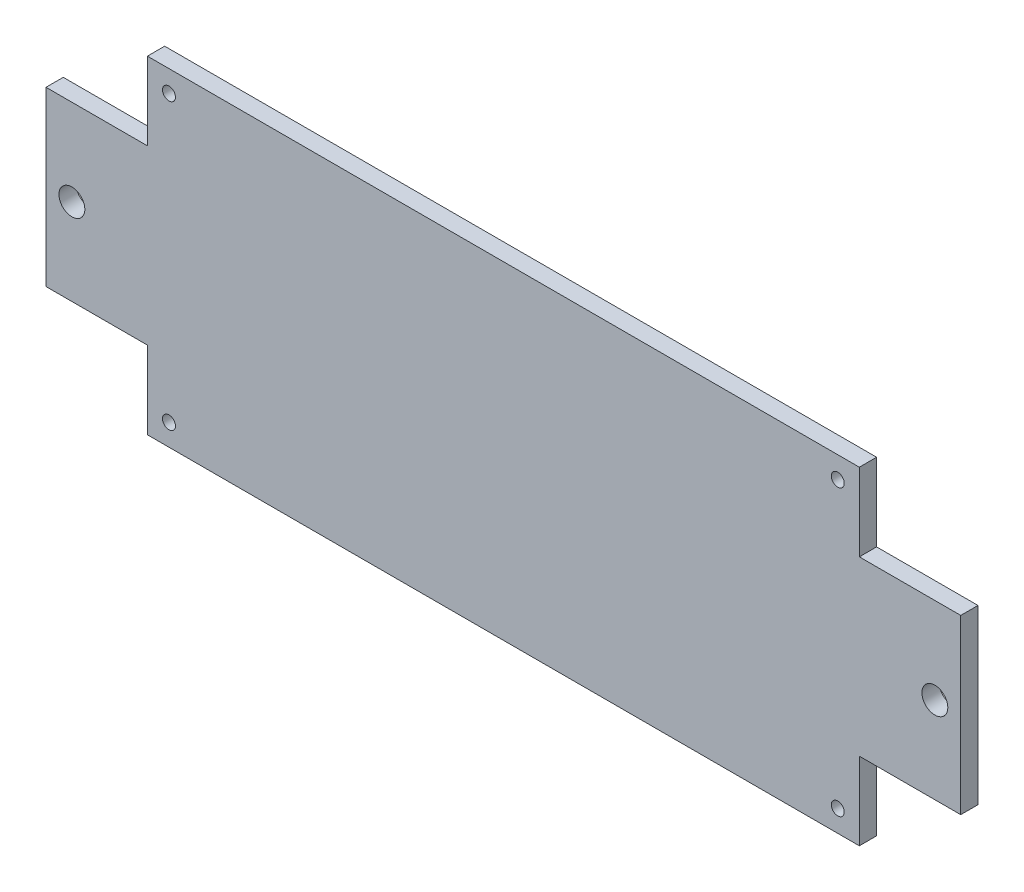
ISO-10303-21;
HEADER;
FILE_DESCRIPTION(('STEP AP214'),'2;1');
FILE_NAME('part.step','',(''),(''),'','','');
FILE_SCHEMA(('AUTOMOTIVE_DESIGN { 1 0 10303 214 1 1 1 1 }'));
ENDSEC;
DATA;
#1=APPLICATION_CONTEXT('core data for automotive mechanical design processes');
#2=APPLICATION_PROTOCOL_DEFINITION('international standard','automotive_design',2000,#1);
#3=PRODUCT_CONTEXT('',#1,'mechanical');
#4=PRODUCT('Part','Part','',(#3));
#5=PRODUCT_RELATED_PRODUCT_CATEGORY('part','',(#4));
#6=PRODUCT_DEFINITION_FORMATION('','',#4);
#7=PRODUCT_DEFINITION_CONTEXT('part definition',#1,'design');
#8=PRODUCT_DEFINITION('design','',#6,#7);
#9=PRODUCT_DEFINITION_SHAPE('','',#8);
#10=(LENGTH_UNIT() NAMED_UNIT(*) SI_UNIT(.MILLI.,.METRE.));
#11=(NAMED_UNIT(*) PLANE_ANGLE_UNIT() SI_UNIT($,.RADIAN.));
#12=(NAMED_UNIT(*) SI_UNIT($,.STERADIAN.) SOLID_ANGLE_UNIT());
#13=UNCERTAINTY_MEASURE_WITH_UNIT(LENGTH_MEASURE(1.E-05),#10,'distance_accuracy_value','');
#14=(GEOMETRIC_REPRESENTATION_CONTEXT(3) GLOBAL_UNCERTAINTY_ASSIGNED_CONTEXT((#13)) GLOBAL_UNIT_ASSIGNED_CONTEXT((#10,
#11,#12)) REPRESENTATION_CONTEXT('',''));
#15=CARTESIAN_POINT('',(0.,0.,0.));
#16=DIRECTION('',(0.,0.,1.));
#17=DIRECTION('',(1.,0.,0.));
#18=AXIS2_PLACEMENT_3D('',#15,#16,#17);
#19=CARTESIAN_POINT('',(0.,0.,4.));
#20=DIRECTION('',(0.,0.,-1.));
#21=DIRECTION('',(-1.,0.,0.));
#22=AXIS2_PLACEMENT_3D('',#19,#20,#21);
#23=PLANE('',#22);
#24=DIRECTION('',(0.,-1.,0.));
#25=VECTOR('',#24,1.);
#26=CARTESIAN_POINT('',(16.5449135824383,45.8482297729376,4.));
#27=LINE('',#26,#25);
#28=CARTESIAN_POINT('',(16.5449135824383,45.8482297729376,4.));
#29=VERTEX_POINT('',#28);
#30=CARTESIAN_POINT('',(16.5449135824383,27.8482297729376,4.));
#31=VERTEX_POINT('',#30);
#32=EDGE_CURVE('E180',#29,#31,#27,.T.);
#33=ORIENTED_EDGE('',*,*,#32,.T.);
#34=DIRECTION('',(-1.,0.,0.));
#35=VECTOR('',#34,1.);
#36=CARTESIAN_POINT('',(16.5449135824383,27.8482297729376,4.));
#37=LINE('',#36,#35);
#38=CARTESIAN_POINT('',(-6.95508641756169,27.8482297729376,4.));
#39=VERTEX_POINT('',#38);
#40=EDGE_CURVE('E108',#31,#39,#37,.T.);
#41=ORIENTED_EDGE('',*,*,#40,.T.);
#42=DIRECTION('',(0.,-1.,0.));
#43=VECTOR('',#42,1.);
#44=CARTESIAN_POINT('',(-6.95508641756169,27.8482297729376,4.));
#45=LINE('',#44,#43);
#46=CARTESIAN_POINT('',(-6.95508641756169,-12.1517702270624,4.));
#47=VERTEX_POINT('',#46);
#48=EDGE_CURVE('E207',#39,#47,#45,.T.);
#49=ORIENTED_EDGE('',*,*,#48,.T.);
#50=DIRECTION('',(1.,0.,0.));
#51=VECTOR('',#50,1.);
#52=CARTESIAN_POINT('',(16.5449135824383,-12.1517702270624,4.));
#53=LINE('',#52,#51);
#54=CARTESIAN_POINT('',(16.5449135824383,-12.1517702270624,4.));
#55=VERTEX_POINT('',#54);
#56=EDGE_CURVE('E226',#47,#55,#53,.T.);
#57=ORIENTED_EDGE('',*,*,#56,.T.);
#58=DIRECTION('',(0.,-1.,0.));
#59=VECTOR('',#58,1.);
#60=CARTESIAN_POINT('',(16.5449135824383,-12.1517702270624,4.));
#61=LINE('',#60,#59);
#62=CARTESIAN_POINT('',(16.5449135824383,-30.1517702270624,4.));
#63=VERTEX_POINT('',#62);
#64=EDGE_CURVE('E223',#55,#63,#61,.T.);
#65=ORIENTED_EDGE('',*,*,#64,.T.);
#66=DIRECTION('',(1.,0.,0.));
#67=VECTOR('',#66,1.);
#68=CARTESIAN_POINT('',(16.5449135824383,-30.1517702270624,4.));
#69=LINE('',#68,#67);
#70=CARTESIAN_POINT('',(181.544913582438,-30.1517702270624,4.));
#71=VERTEX_POINT('',#70);
#72=EDGE_CURVE('E225',#63,#71,#69,.T.);
#73=ORIENTED_EDGE('',*,*,#72,.T.);
#74=DIRECTION('',(0.,1.,0.));
#75=VECTOR('',#74,1.);
#76=CARTESIAN_POINT('',(181.544913582438,-12.1517702270624,4.));
#77=LINE('',#76,#75);
#78=CARTESIAN_POINT('',(181.544913582438,-12.1517702270624,4.));
#79=VERTEX_POINT('',#78);
#80=EDGE_CURVE('E228',#71,#79,#77,.T.);
#81=ORIENTED_EDGE('',*,*,#80,.T.);
#82=DIRECTION('',(1.,0.,0.));
#83=VECTOR('',#82,1.);
#84=CARTESIAN_POINT('',(181.544913582438,-12.1517702270624,4.));
#85=LINE('',#84,#83);
#86=CARTESIAN_POINT('',(205.044913582438,-12.1517702270624,4.));
#87=VERTEX_POINT('',#86);
#88=EDGE_CURVE('E234',#79,#87,#85,.T.);
#89=ORIENTED_EDGE('',*,*,#88,.T.);
#90=DIRECTION('',(0.,1.,0.));
#91=VECTOR('',#90,1.);
#92=CARTESIAN_POINT('',(205.044913582438,27.8482297729376,4.));
#93=LINE('',#92,#91);
#94=CARTESIAN_POINT('',(205.044913582438,27.8482297729376,4.));
#95=VERTEX_POINT('',#94);
#96=EDGE_CURVE('E139',#87,#95,#93,.T.);
#97=ORIENTED_EDGE('',*,*,#96,.T.);
#98=DIRECTION('',(-1.,0.,0.));
#99=VECTOR('',#98,1.);
#100=CARTESIAN_POINT('',(181.544913582438,27.8482297729376,4.));
#101=LINE('',#100,#99);
#102=CARTESIAN_POINT('',(181.544913582438,27.8482297729376,4.));
#103=VERTEX_POINT('',#102);
#104=EDGE_CURVE('E133',#95,#103,#101,.T.);
#105=ORIENTED_EDGE('',*,*,#104,.T.);
#106=DIRECTION('',(0.,1.,0.));
#107=VECTOR('',#106,1.);
#108=CARTESIAN_POINT('',(181.544913582438,45.8482297729376,4.));
#109=LINE('',#108,#107);
#110=CARTESIAN_POINT('',(181.544913582438,45.8482297729376,4.));
#111=VERTEX_POINT('',#110);
#112=EDGE_CURVE('E137',#103,#111,#109,.T.);
#113=ORIENTED_EDGE('',*,*,#112,.T.);
#114=DIRECTION('',(-1.,0.,0.));
#115=VECTOR('',#114,1.);
#116=CARTESIAN_POINT('',(16.5449135824383,45.8482297729376,4.));
#117=LINE('',#116,#115);
#118=EDGE_CURVE('E53',#111,#29,#117,.T.);
#119=ORIENTED_EDGE('',*,*,#118,.T.);
#120=EDGE_LOOP('',(#33,#41,#49,#57,#65,#73,#81,#89,#97,#105,#113,#119));
#121=FACE_BOUND('',#120,.T.);
#122=CARTESIAN_POINT('',(21.5449135824383,-25.1517702270624,4.));
#123=DIRECTION('',(0.,0.,1.));
#124=DIRECTION('',(1.,0.,0.));
#125=AXIS2_PLACEMENT_3D('',#122,#123,#124);
#126=CIRCLE('',#125,1.5);
#127=CARTESIAN_POINT('',(23.0449135824383,-25.1517702270624,4.));
#128=VERTEX_POINT('',#127);
#129=EDGE_CURVE('E161',#128,#128,#126,.T.);
#130=ORIENTED_EDGE('',*,*,#129,.F.);
#131=EDGE_LOOP('',(#130));
#132=FACE_BOUND('',#131,.T.);
#133=CARTESIAN_POINT('',(176.544913582438,-25.1517702270624,4.));
#134=DIRECTION('',(0.,0.,1.));
#135=DIRECTION('',(-1.,0.,0.));
#136=AXIS2_PLACEMENT_3D('',#133,#134,#135);
#137=CIRCLE('',#136,1.5);
#138=CARTESIAN_POINT('',(175.044913582438,-25.1517702270624,4.));
#139=VERTEX_POINT('',#138);
#140=EDGE_CURVE('E318',#139,#139,#137,.T.);
#141=ORIENTED_EDGE('',*,*,#140,.F.);
#142=EDGE_LOOP('',(#141));
#143=FACE_BOUND('',#142,.T.);
#144=CARTESIAN_POINT('',(176.544913582438,40.8482297729376,4.));
#145=DIRECTION('',(0.,0.,1.));
#146=DIRECTION('',(1.,0.,0.));
#147=AXIS2_PLACEMENT_3D('',#144,#145,#146);
#148=CIRCLE('',#147,1.5);
#149=CARTESIAN_POINT('',(178.044913582438,40.8482297729376,4.));
#150=VERTEX_POINT('',#149);
#151=EDGE_CURVE('E312',#150,#150,#148,.T.);
#152=ORIENTED_EDGE('',*,*,#151,.F.);
#153=EDGE_LOOP('',(#152));
#154=FACE_BOUND('',#153,.T.);
#155=CARTESIAN_POINT('',(21.5449135824383,40.8482297729376,4.));
#156=DIRECTION('',(0.,0.,1.));
#157=DIRECTION('',(-1.,0.,0.));
#158=AXIS2_PLACEMENT_3D('',#155,#156,#157);
#159=CIRCLE('',#158,1.5);
#160=CARTESIAN_POINT('',(20.0449135824383,40.8482297729376,4.));
#161=VERTEX_POINT('',#160);
#162=EDGE_CURVE('E306',#161,#161,#159,.T.);
#163=ORIENTED_EDGE('',*,*,#162,.F.);
#164=EDGE_LOOP('',(#163));
#165=FACE_BOUND('',#164,.T.);
#166=CARTESIAN_POINT('',(-0.955086417561701,7.84822977293764,4.));
#167=DIRECTION('',(0.,0.,1.));
#168=DIRECTION('',(-1.,0.,0.));
#169=AXIS2_PLACEMENT_3D('',#166,#167,#168);
#170=CIRCLE('',#169,3.);
#171=CARTESIAN_POINT('',(-3.9550864175617,7.84822977293764,4.));
#172=VERTEX_POINT('',#171);
#173=EDGE_CURVE('E300',#172,#172,#170,.T.);
#174=ORIENTED_EDGE('',*,*,#173,.F.);
#175=EDGE_LOOP('',(#174));
#176=FACE_BOUND('',#175,.T.);
#177=CARTESIAN_POINT('',(199.044913582438,7.84822977293764,4.));
#178=DIRECTION('',(0.,0.,1.));
#179=DIRECTION('',(1.,0.,0.));
#180=AXIS2_PLACEMENT_3D('',#177,#178,#179);
#181=CIRCLE('',#180,2.99999999999999);
#182=CARTESIAN_POINT('',(202.044913582438,7.84822977293764,4.));
#183=VERTEX_POINT('',#182);
#184=EDGE_CURVE('E291',#183,#183,#181,.T.);
#185=ORIENTED_EDGE('',*,*,#184,.F.);
#186=EDGE_LOOP('',(#185));
#187=FACE_BOUND('',#186,.T.);
#188=ADVANCED_FACE('F36',(#121,#132,#143,#154,#165,#176,#187),#23,.F.);
#189=CARTESIAN_POINT('',(0.,0.,0.));
#190=DIRECTION('',(0.,0.,-1.));
#191=DIRECTION('',(-1.,0.,0.));
#192=AXIS2_PLACEMENT_3D('',#189,#190,#191);
#193=PLANE('',#192);
#194=CARTESIAN_POINT('',(-0.955086417561701,7.84822977293764,0.));
#195=DIRECTION('',(0.,0.,1.));
#196=DIRECTION('',(-1.,0.,0.));
#197=AXIS2_PLACEMENT_3D('',#194,#195,#196);
#198=CIRCLE('',#197,3.);
#199=CARTESIAN_POINT('',(-3.9550864175617,7.84822977293764,0.));
#200=VERTEX_POINT('',#199);
#201=EDGE_CURVE('E297',#200,#200,#198,.T.);
#202=ORIENTED_EDGE('',*,*,#201,.T.);
#203=EDGE_LOOP('',(#202));
#204=FACE_BOUND('',#203,.T.);
#205=CARTESIAN_POINT('',(176.544913582438,40.8482297729376,0.));
#206=DIRECTION('',(0.,0.,1.));
#207=DIRECTION('',(1.,0.,0.));
#208=AXIS2_PLACEMENT_3D('',#205,#206,#207);
#209=CIRCLE('',#208,1.5);
#210=CARTESIAN_POINT('',(178.044913582438,40.8482297729376,0.));
#211=VERTEX_POINT('',#210);
#212=EDGE_CURVE('E309',#211,#211,#209,.T.);
#213=ORIENTED_EDGE('',*,*,#212,.T.);
#214=EDGE_LOOP('',(#213));
#215=FACE_BOUND('',#214,.T.);
#216=CARTESIAN_POINT('',(21.5449135824383,-25.1517702270624,0.));
#217=DIRECTION('',(0.,0.,1.));
#218=DIRECTION('',(1.,0.,0.));
#219=AXIS2_PLACEMENT_3D('',#216,#217,#218);
#220=CIRCLE('',#219,1.5);
#221=CARTESIAN_POINT('',(23.0449135824383,-25.1517702270624,0.));
#222=VERTEX_POINT('',#221);
#223=EDGE_CURVE('E321',#222,#222,#220,.T.);
#224=ORIENTED_EDGE('',*,*,#223,.T.);
#225=EDGE_LOOP('',(#224));
#226=FACE_BOUND('',#225,.T.);
#227=DIRECTION('',(0.,-1.,0.));
#228=VECTOR('',#227,1.);
#229=CARTESIAN_POINT('',(16.5449135824383,45.8482297729376,0.));
#230=LINE('',#229,#228);
#231=CARTESIAN_POINT('',(16.5449135824383,45.8482297729376,0.));
#232=VERTEX_POINT('',#231);
#233=CARTESIAN_POINT('',(16.5449135824383,27.8482297729376,0.));
#234=VERTEX_POINT('',#233);
#235=EDGE_CURVE('E157',#232,#234,#230,.T.);
#236=ORIENTED_EDGE('',*,*,#235,.F.);
#237=DIRECTION('',(-1.,0.,0.));
#238=VECTOR('',#237,1.);
#239=CARTESIAN_POINT('',(16.5449135824383,45.8482297729376,0.));
#240=LINE('',#239,#238);
#241=CARTESIAN_POINT('',(181.544913582438,45.8482297729376,0.));
#242=VERTEX_POINT('',#241);
#243=EDGE_CURVE('E100',#242,#232,#240,.T.);
#244=ORIENTED_EDGE('',*,*,#243,.F.);
#245=DIRECTION('',(0.,1.,0.));
#246=VECTOR('',#245,1.);
#247=CARTESIAN_POINT('',(181.544913582438,45.8482297729376,0.));
#248=LINE('',#247,#246);
#249=CARTESIAN_POINT('',(181.544913582438,27.8482297729376,0.));
#250=VERTEX_POINT('',#249);
#251=EDGE_CURVE('E94',#250,#242,#248,.T.);
#252=ORIENTED_EDGE('',*,*,#251,.F.);
#253=DIRECTION('',(-1.,0.,0.));
#254=VECTOR('',#253,1.);
#255=CARTESIAN_POINT('',(181.544913582438,27.8482297729376,0.));
#256=LINE('',#255,#254);
#257=CARTESIAN_POINT('',(205.044913582438,27.8482297729376,0.));
#258=VERTEX_POINT('',#257);
#259=EDGE_CURVE('E147',#258,#250,#256,.T.);
#260=ORIENTED_EDGE('',*,*,#259,.F.);
#261=DIRECTION('',(0.,1.,0.));
#262=VECTOR('',#261,1.);
#263=CARTESIAN_POINT('',(205.044913582438,27.8482297729376,0.));
#264=LINE('',#263,#262);
#265=CARTESIAN_POINT('',(205.044913582438,-12.1517702270624,0.));
#266=VERTEX_POINT('',#265);
#267=EDGE_CURVE('E175',#266,#258,#264,.T.);
#268=ORIENTED_EDGE('',*,*,#267,.F.);
#269=DIRECTION('',(1.,0.,0.));
#270=VECTOR('',#269,1.);
#271=CARTESIAN_POINT('',(181.544913582438,-12.1517702270624,0.));
#272=LINE('',#271,#270);
#273=CARTESIAN_POINT('',(181.544913582438,-12.1517702270624,0.));
#274=VERTEX_POINT('',#273);
#275=EDGE_CURVE('E173',#274,#266,#272,.T.);
#276=ORIENTED_EDGE('',*,*,#275,.F.);
#277=DIRECTION('',(0.,1.,0.));
#278=VECTOR('',#277,1.);
#279=CARTESIAN_POINT('',(181.544913582438,-12.1517702270624,0.));
#280=LINE('',#279,#278);
#281=CARTESIAN_POINT('',(181.544913582438,-30.1517702270624,0.));
#282=VERTEX_POINT('',#281);
#283=EDGE_CURVE('E171',#282,#274,#280,.T.);
#284=ORIENTED_EDGE('',*,*,#283,.F.);
#285=DIRECTION('',(1.,0.,0.));
#286=VECTOR('',#285,1.);
#287=CARTESIAN_POINT('',(16.5449135824383,-30.1517702270624,0.));
#288=LINE('',#287,#286);
#289=CARTESIAN_POINT('',(16.5449135824383,-30.1517702270624,0.));
#290=VERTEX_POINT('',#289);
#291=EDGE_CURVE('E169',#290,#282,#288,.T.);
#292=ORIENTED_EDGE('',*,*,#291,.F.);
#293=DIRECTION('',(0.,-1.,0.));
#294=VECTOR('',#293,1.);
#295=CARTESIAN_POINT('',(16.5449135824383,-12.1517702270624,0.));
#296=LINE('',#295,#294);
#297=CARTESIAN_POINT('',(16.5449135824383,-12.1517702270624,0.));
#298=VERTEX_POINT('',#297);
#299=EDGE_CURVE('E167',#298,#290,#296,.T.);
#300=ORIENTED_EDGE('',*,*,#299,.F.);
#301=DIRECTION('',(1.,0.,0.));
#302=VECTOR('',#301,1.);
#303=CARTESIAN_POINT('',(16.5449135824383,-12.1517702270624,0.));
#304=LINE('',#303,#302);
#305=CARTESIAN_POINT('',(-6.95508641756169,-12.1517702270624,0.));
#306=VERTEX_POINT('',#305);
#307=EDGE_CURVE('E165',#306,#298,#304,.T.);
#308=ORIENTED_EDGE('',*,*,#307,.F.);
#309=DIRECTION('',(0.,-1.,0.));
#310=VECTOR('',#309,1.);
#311=CARTESIAN_POINT('',(-6.95508641756169,27.8482297729376,0.));
#312=LINE('',#311,#310);
#313=CARTESIAN_POINT('',(-6.95508641756169,27.8482297729376,0.));
#314=VERTEX_POINT('',#313);
#315=EDGE_CURVE('E163',#314,#306,#312,.T.);
#316=ORIENTED_EDGE('',*,*,#315,.F.);
#317=DIRECTION('',(-1.,0.,0.));
#318=VECTOR('',#317,1.);
#319=CARTESIAN_POINT('',(16.5449135824383,27.8482297729376,0.));
#320=LINE('',#319,#318);
#321=EDGE_CURVE('E160',#234,#314,#320,.T.);
#322=ORIENTED_EDGE('',*,*,#321,.F.);
#323=EDGE_LOOP('',(#236,#244,#252,#260,#268,#276,#284,#292,#300,#308,#316,#322));
#324=FACE_BOUND('',#323,.T.);
#325=CARTESIAN_POINT('',(176.544913582438,-25.1517702270624,0.));
#326=DIRECTION('',(0.,0.,1.));
#327=DIRECTION('',(-1.,0.,0.));
#328=AXIS2_PLACEMENT_3D('',#325,#326,#327);
#329=CIRCLE('',#328,1.5);
#330=CARTESIAN_POINT('',(175.044913582438,-25.1517702270624,0.));
#331=VERTEX_POINT('',#330);
#332=EDGE_CURVE('E315',#331,#331,#329,.T.);
#333=ORIENTED_EDGE('',*,*,#332,.T.);
#334=EDGE_LOOP('',(#333));
#335=FACE_BOUND('',#334,.T.);
#336=CARTESIAN_POINT('',(21.5449135824383,40.8482297729376,0.));
#337=DIRECTION('',(0.,0.,1.));
#338=DIRECTION('',(-1.,0.,0.));
#339=AXIS2_PLACEMENT_3D('',#336,#337,#338);
#340=CIRCLE('',#339,1.5);
#341=CARTESIAN_POINT('',(20.0449135824383,40.8482297729376,0.));
#342=VERTEX_POINT('',#341);
#343=EDGE_CURVE('E303',#342,#342,#340,.T.);
#344=ORIENTED_EDGE('',*,*,#343,.T.);
#345=EDGE_LOOP('',(#344));
#346=FACE_BOUND('',#345,.T.);
#347=CARTESIAN_POINT('',(199.044913582438,7.84822977293764,0.));
#348=DIRECTION('',(0.,0.,1.));
#349=DIRECTION('',(1.,0.,0.));
#350=AXIS2_PLACEMENT_3D('',#347,#348,#349);
#351=CIRCLE('',#350,2.99999999999999);
#352=CARTESIAN_POINT('',(202.044913582438,7.84822977293764,0.));
#353=VERTEX_POINT('',#352);
#354=EDGE_CURVE('E294',#353,#353,#351,.T.);
#355=ORIENTED_EDGE('',*,*,#354,.T.);
#356=EDGE_LOOP('',(#355));
#357=FACE_BOUND('',#356,.T.);
#358=ADVANCED_FACE('F211',(#204,#215,#226,#324,#335,#346,#357),#193,.T.);
#359=CARTESIAN_POINT('',(16.5449135824383,45.8482297729376,4.));
#360=DIRECTION('',(1.,0.,0.));
#361=DIRECTION('',(0.,0.,-1.));
#362=AXIS2_PLACEMENT_3D('',#359,#360,#361);
#363=PLANE('',#362);
#364=ORIENTED_EDGE('',*,*,#235,.T.);
#365=DIRECTION('',(0.,0.,-1.));
#366=VECTOR('',#365,1.);
#367=CARTESIAN_POINT('',(16.5449135824383,27.8482297729376,4.));
#368=LINE('',#367,#366);
#369=EDGE_CURVE('E11',#31,#234,#368,.T.);
#370=ORIENTED_EDGE('',*,*,#369,.F.);
#371=ORIENTED_EDGE('',*,*,#32,.F.);
#372=DIRECTION('',(0.,0.,-1.));
#373=VECTOR('',#372,1.);
#374=CARTESIAN_POINT('',(16.5449135824383,45.8482297729376,4.));
#375=LINE('',#374,#373);
#376=EDGE_CURVE('E153',#29,#232,#375,.T.);
#377=ORIENTED_EDGE('',*,*,#376,.T.);
#378=EDGE_LOOP('',(#364,#370,#371,#377));
#379=FACE_BOUND('',#378,.T.);
#380=ADVANCED_FACE('F38',(#379),#363,.F.);
#381=CARTESIAN_POINT('',(16.5449135824383,27.8482297729376,4.));
#382=DIRECTION('',(0.,-1.,0.));
#383=DIRECTION('',(1.,0.,0.));
#384=AXIS2_PLACEMENT_3D('',#381,#382,#383);
#385=PLANE('',#384);
#386=ORIENTED_EDGE('',*,*,#321,.T.);
#387=DIRECTION('',(0.,0.,-1.));
#388=VECTOR('',#387,1.);
#389=CARTESIAN_POINT('',(-6.95508641756169,27.8482297729376,4.));
#390=LINE('',#389,#388);
#391=EDGE_CURVE('E45',#39,#314,#390,.T.);
#392=ORIENTED_EDGE('',*,*,#391,.F.);
#393=ORIENTED_EDGE('',*,*,#40,.F.);
#394=ORIENTED_EDGE('',*,*,#369,.T.);
#395=EDGE_LOOP('',(#386,#392,#393,#394));
#396=FACE_BOUND('',#395,.T.);
#397=ADVANCED_FACE('F451',(#396),#385,.F.);
#398=CARTESIAN_POINT('',(-6.95508641756169,27.8482297729376,4.));
#399=DIRECTION('',(1.,0.,0.));
#400=DIRECTION('',(0.,1.,0.));
#401=AXIS2_PLACEMENT_3D('',#398,#399,#400);
#402=PLANE('',#401);
#403=ORIENTED_EDGE('',*,*,#315,.T.);
#404=DIRECTION('',(0.,0.,-1.));
#405=VECTOR('',#404,1.);
#406=CARTESIAN_POINT('',(-6.95508641756169,-12.1517702270624,4.));
#407=LINE('',#406,#405);
#408=EDGE_CURVE('E199',#47,#306,#407,.T.);
#409=ORIENTED_EDGE('',*,*,#408,.F.);
#410=ORIENTED_EDGE('',*,*,#48,.F.);
#411=ORIENTED_EDGE('',*,*,#391,.T.);
#412=EDGE_LOOP('',(#403,#409,#410,#411));
#413=FACE_BOUND('',#412,.T.);
#414=ADVANCED_FACE('F205',(#413),#402,.F.);
#415=CARTESIAN_POINT('',(16.5449135824383,-12.1517702270624,4.));
#416=DIRECTION('',(0.,1.,0.));
#417=DIRECTION('',(-1.,0.,0.));
#418=AXIS2_PLACEMENT_3D('',#415,#416,#417);
#419=PLANE('',#418);
#420=ORIENTED_EDGE('',*,*,#307,.T.);
#421=DIRECTION('',(0.,0.,-1.));
#422=VECTOR('',#421,1.);
#423=CARTESIAN_POINT('',(16.5449135824383,-12.1517702270624,4.));
#424=LINE('',#423,#422);
#425=EDGE_CURVE('E196',#55,#298,#424,.T.);
#426=ORIENTED_EDGE('',*,*,#425,.F.);
#427=ORIENTED_EDGE('',*,*,#56,.F.);
#428=ORIENTED_EDGE('',*,*,#408,.T.);
#429=EDGE_LOOP('',(#420,#426,#427,#428));
#430=FACE_BOUND('',#429,.T.);
#431=ADVANCED_FACE('F217',(#430),#419,.F.);
#432=CARTESIAN_POINT('',(16.5449135824383,-12.1517702270624,4.));
#433=DIRECTION('',(1.,0.,0.));
#434=DIRECTION('',(0.,1.,0.));
#435=AXIS2_PLACEMENT_3D('',#432,#433,#434);
#436=PLANE('',#435);
#437=ORIENTED_EDGE('',*,*,#299,.T.);
#438=DIRECTION('',(0.,0.,-1.));
#439=VECTOR('',#438,1.);
#440=CARTESIAN_POINT('',(16.5449135824383,-30.1517702270624,4.));
#441=LINE('',#440,#439);
#442=EDGE_CURVE('E193',#63,#290,#441,.T.);
#443=ORIENTED_EDGE('',*,*,#442,.F.);
#444=ORIENTED_EDGE('',*,*,#64,.F.);
#445=ORIENTED_EDGE('',*,*,#425,.T.);
#446=EDGE_LOOP('',(#437,#443,#444,#445));
#447=FACE_BOUND('',#446,.T.);
#448=ADVANCED_FACE('F221',(#447),#436,.F.);
#449=CARTESIAN_POINT('',(16.5449135824383,-30.1517702270624,4.));
#450=DIRECTION('',(0.,1.,0.));
#451=DIRECTION('',(0.,0.,1.));
#452=AXIS2_PLACEMENT_3D('',#449,#450,#451);
#453=PLANE('',#452);
#454=ORIENTED_EDGE('',*,*,#291,.T.);
#455=DIRECTION('',(0.,0.,-1.));
#456=VECTOR('',#455,1.);
#457=CARTESIAN_POINT('',(181.544913582438,-30.1517702270624,4.));
#458=LINE('',#457,#456);
#459=EDGE_CURVE('E190',#71,#282,#458,.T.);
#460=ORIENTED_EDGE('',*,*,#459,.F.);
#461=ORIENTED_EDGE('',*,*,#72,.F.);
#462=ORIENTED_EDGE('',*,*,#442,.T.);
#463=EDGE_LOOP('',(#454,#460,#461,#462));
#464=FACE_BOUND('',#463,.T.);
#465=ADVANCED_FACE('F416',(#464),#453,.F.);
#466=CARTESIAN_POINT('',(181.544913582438,-12.1517702270624,4.));
#467=DIRECTION('',(-1.,0.,0.));
#468=DIRECTION('',(0.,-1.,0.));
#469=AXIS2_PLACEMENT_3D('',#466,#467,#468);
#470=PLANE('',#469);
#471=ORIENTED_EDGE('',*,*,#283,.T.);
#472=DIRECTION('',(0.,0.,-1.));
#473=VECTOR('',#472,1.);
#474=CARTESIAN_POINT('',(181.544913582438,-12.1517702270624,4.));
#475=LINE('',#474,#473);
#476=EDGE_CURVE('E187',#79,#274,#475,.T.);
#477=ORIENTED_EDGE('',*,*,#476,.F.);
#478=ORIENTED_EDGE('',*,*,#80,.F.);
#479=ORIENTED_EDGE('',*,*,#459,.T.);
#480=EDGE_LOOP('',(#471,#477,#478,#479));
#481=FACE_BOUND('',#480,.T.);
#482=ADVANCED_FACE('F407',(#481),#470,.F.);
#483=CARTESIAN_POINT('',(181.544913582438,-12.1517702270624,4.));
#484=DIRECTION('',(0.,1.,0.));
#485=DIRECTION('',(0.,0.,1.));
#486=AXIS2_PLACEMENT_3D('',#483,#484,#485);
#487=PLANE('',#486);
#488=ORIENTED_EDGE('',*,*,#275,.T.);
#489=DIRECTION('',(0.,0.,-1.));
#490=VECTOR('',#489,1.);
#491=CARTESIAN_POINT('',(205.044913582438,-12.1517702270624,4.));
#492=LINE('',#491,#490);
#493=EDGE_CURVE('E184',#87,#266,#492,.T.);
#494=ORIENTED_EDGE('',*,*,#493,.F.);
#495=ORIENTED_EDGE('',*,*,#88,.F.);
#496=ORIENTED_EDGE('',*,*,#476,.T.);
#497=EDGE_LOOP('',(#488,#494,#495,#496));
#498=FACE_BOUND('',#497,.T.);
#499=ADVANCED_FACE('F240',(#498),#487,.F.);
#500=CARTESIAN_POINT('',(205.044913582438,27.8482297729376,4.));
#501=DIRECTION('',(-1.,0.,0.));
#502=DIRECTION('',(0.,0.,1.));
#503=AXIS2_PLACEMENT_3D('',#500,#501,#502);
#504=PLANE('',#503);
#505=ORIENTED_EDGE('',*,*,#267,.T.);
#506=DIRECTION('',(0.,0.,-1.));
#507=VECTOR('',#506,1.);
#508=CARTESIAN_POINT('',(205.044913582438,27.8482297729376,4.));
#509=LINE('',#508,#507);
#510=EDGE_CURVE('E148',#95,#258,#509,.T.);
#511=ORIENTED_EDGE('',*,*,#510,.F.);
#512=ORIENTED_EDGE('',*,*,#96,.F.);
#513=ORIENTED_EDGE('',*,*,#493,.T.);
#514=EDGE_LOOP('',(#505,#511,#512,#513));
#515=FACE_BOUND('',#514,.T.);
#516=ADVANCED_FACE('F244',(#515),#504,.F.);
#517=CARTESIAN_POINT('',(181.544913582438,27.8482297729376,4.));
#518=DIRECTION('',(0.,-1.,0.));
#519=DIRECTION('',(0.,0.,-1.));
#520=AXIS2_PLACEMENT_3D('',#517,#518,#519);
#521=PLANE('',#520);
#522=ORIENTED_EDGE('',*,*,#259,.T.);
#523=DIRECTION('',(0.,0.,-1.));
#524=VECTOR('',#523,1.);
#525=CARTESIAN_POINT('',(181.544913582438,27.8482297729376,4.));
#526=LINE('',#525,#524);
#527=EDGE_CURVE('E144',#103,#250,#526,.T.);
#528=ORIENTED_EDGE('',*,*,#527,.F.);
#529=ORIENTED_EDGE('',*,*,#104,.F.);
#530=ORIENTED_EDGE('',*,*,#510,.T.);
#531=EDGE_LOOP('',(#522,#528,#529,#530));
#532=FACE_BOUND('',#531,.T.);
#533=ADVANCED_FACE('F145',(#532),#521,.F.);
#534=CARTESIAN_POINT('',(181.544913582438,45.8482297729376,4.));
#535=DIRECTION('',(-1.,0.,0.));
#536=DIRECTION('',(0.,0.,1.));
#537=AXIS2_PLACEMENT_3D('',#534,#535,#536);
#538=PLANE('',#537);
#539=ORIENTED_EDGE('',*,*,#251,.T.);
#540=DIRECTION('',(0.,0.,-1.));
#541=VECTOR('',#540,1.);
#542=CARTESIAN_POINT('',(181.544913582438,45.8482297729376,4.));
#543=LINE('',#542,#541);
#544=EDGE_CURVE('E149',#111,#242,#543,.T.);
#545=ORIENTED_EDGE('',*,*,#544,.F.);
#546=ORIENTED_EDGE('',*,*,#112,.F.);
#547=ORIENTED_EDGE('',*,*,#527,.T.);
#548=EDGE_LOOP('',(#539,#545,#546,#547));
#549=FACE_BOUND('',#548,.T.);
#550=ADVANCED_FACE('F151',(#549),#538,.F.);
#551=CARTESIAN_POINT('',(16.5449135824383,45.8482297729376,4.));
#552=DIRECTION('',(0.,-1.,0.));
#553=DIRECTION('',(0.,0.,-1.));
#554=AXIS2_PLACEMENT_3D('',#551,#552,#553);
#555=PLANE('',#554);
#556=ORIENTED_EDGE('',*,*,#243,.T.);
#557=ORIENTED_EDGE('',*,*,#376,.F.);
#558=ORIENTED_EDGE('',*,*,#118,.F.);
#559=ORIENTED_EDGE('',*,*,#544,.T.);
#560=EDGE_LOOP('',(#556,#557,#558,#559));
#561=FACE_BOUND('',#560,.T.);
#562=ADVANCED_FACE('F248',(#561),#555,.F.);
#563=CARTESIAN_POINT('',(21.5449135824383,-25.1517702270624,4.));
#564=DIRECTION('',(0.,0.,-1.));
#565=DIRECTION('',(-1.,0.,0.));
#566=AXIS2_PLACEMENT_3D('',#563,#564,#565);
#567=CYLINDRICAL_SURFACE('',#566,1.5);
#568=ORIENTED_EDGE('',*,*,#129,.T.);
#569=EDGE_LOOP('',(#568));
#570=FACE_BOUND('',#569,.T.);
#571=ORIENTED_EDGE('',*,*,#223,.F.);
#572=EDGE_LOOP('',(#571));
#573=FACE_BOUND('',#572,.T.);
#574=ADVANCED_FACE('F250',(#570,#573),#567,.F.);
#575=CARTESIAN_POINT('',(176.544913582438,-25.1517702270624,4.));
#576=DIRECTION('',(0.,0.,-1.));
#577=DIRECTION('',(-1.,0.,0.));
#578=AXIS2_PLACEMENT_3D('',#575,#576,#577);
#579=CYLINDRICAL_SURFACE('',#578,1.5);
#580=ORIENTED_EDGE('',*,*,#140,.T.);
#581=EDGE_LOOP('',(#580));
#582=FACE_BOUND('',#581,.T.);
#583=ORIENTED_EDGE('',*,*,#332,.F.);
#584=EDGE_LOOP('',(#583));
#585=FACE_BOUND('',#584,.T.);
#586=ADVANCED_FACE('F256',(#582,#585),#579,.F.);
#587=CARTESIAN_POINT('',(176.544913582438,40.8482297729376,4.));
#588=DIRECTION('',(0.,0.,-1.));
#589=DIRECTION('',(-1.,0.,0.));
#590=AXIS2_PLACEMENT_3D('',#587,#588,#589);
#591=CYLINDRICAL_SURFACE('',#590,1.5);
#592=ORIENTED_EDGE('',*,*,#151,.T.);
#593=EDGE_LOOP('',(#592));
#594=FACE_BOUND('',#593,.T.);
#595=ORIENTED_EDGE('',*,*,#212,.F.);
#596=EDGE_LOOP('',(#595));
#597=FACE_BOUND('',#596,.T.);
#598=ADVANCED_FACE('F270',(#594,#597),#591,.F.);
#599=CARTESIAN_POINT('',(21.5449135824383,40.8482297729376,4.));
#600=DIRECTION('',(0.,0.,-1.));
#601=DIRECTION('',(-1.,0.,0.));
#602=AXIS2_PLACEMENT_3D('',#599,#600,#601);
#603=CYLINDRICAL_SURFACE('',#602,1.5);
#604=ORIENTED_EDGE('',*,*,#162,.T.);
#605=EDGE_LOOP('',(#604));
#606=FACE_BOUND('',#605,.T.);
#607=ORIENTED_EDGE('',*,*,#343,.F.);
#608=EDGE_LOOP('',(#607));
#609=FACE_BOUND('',#608,.T.);
#610=ADVANCED_FACE('F274',(#606,#609),#603,.F.);
#611=CARTESIAN_POINT('',(-0.955086417561701,7.84822977293764,4.));
#612=DIRECTION('',(0.,0.,-1.));
#613=DIRECTION('',(-1.,0.,0.));
#614=AXIS2_PLACEMENT_3D('',#611,#612,#613);
#615=CYLINDRICAL_SURFACE('',#614,3.);
#616=ORIENTED_EDGE('',*,*,#173,.T.);
#617=EDGE_LOOP('',(#616));
#618=FACE_BOUND('',#617,.T.);
#619=ORIENTED_EDGE('',*,*,#201,.F.);
#620=EDGE_LOOP('',(#619));
#621=FACE_BOUND('',#620,.T.);
#622=ADVANCED_FACE('F278',(#618,#621),#615,.F.);
#623=CARTESIAN_POINT('',(199.044913582438,7.84822977293764,4.));
#624=DIRECTION('',(0.,0.,-1.));
#625=DIRECTION('',(-1.,0.,0.));
#626=AXIS2_PLACEMENT_3D('',#623,#624,#625);
#627=CYLINDRICAL_SURFACE('',#626,2.99999999999999);
#628=ORIENTED_EDGE('',*,*,#184,.T.);
#629=EDGE_LOOP('',(#628));
#630=FACE_BOUND('',#629,.T.);
#631=ORIENTED_EDGE('',*,*,#354,.F.);
#632=EDGE_LOOP('',(#631));
#633=FACE_BOUND('',#632,.T.);
#634=ADVANCED_FACE('F282',(#630,#633),#627,.F.);
#635=CLOSED_SHELL('',(#188,#358,#380,#397,#414,#431,#448,#465,#482,#499,#516,#533,#550,#562,
#574,#586,#598,#610,#622,#634));
#636=MANIFOLD_SOLID_BREP('B2',#635);
#637=ADVANCED_BREP_SHAPE_REPRESENTATION('',(#18,#636),#14);
#638=SHAPE_DEFINITION_REPRESENTATION(#9,#637);
ENDSEC;
END-ISO-10303-21;
